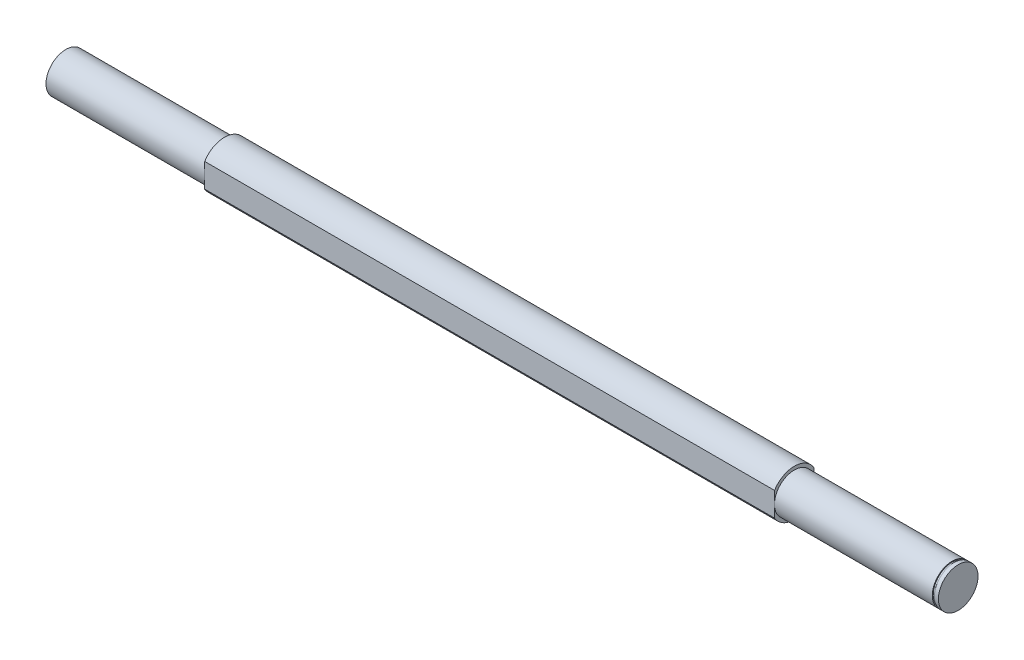
ISO-10303-21;
HEADER;
FILE_DESCRIPTION(('STEP AP214'),'2;1');
FILE_NAME('part.step','',(''),(''),'','','');
FILE_SCHEMA(('AUTOMOTIVE_DESIGN { 1 0 10303 214 1 1 1 1 }'));
ENDSEC;
DATA;
#1=APPLICATION_CONTEXT('core data for automotive mechanical design processes');
#2=APPLICATION_PROTOCOL_DEFINITION('international standard','automotive_design',2000,#1);
#3=PRODUCT_CONTEXT('',#1,'mechanical');
#4=PRODUCT('Part','Part','',(#3));
#5=PRODUCT_RELATED_PRODUCT_CATEGORY('part','',(#4));
#6=PRODUCT_DEFINITION_FORMATION('','',#4);
#7=PRODUCT_DEFINITION_CONTEXT('part definition',#1,'design');
#8=PRODUCT_DEFINITION('design','',#6,#7);
#9=PRODUCT_DEFINITION_SHAPE('','',#8);
#10=(LENGTH_UNIT() NAMED_UNIT(*) SI_UNIT(.MILLI.,.METRE.));
#11=(NAMED_UNIT(*) PLANE_ANGLE_UNIT() SI_UNIT($,.RADIAN.));
#12=(NAMED_UNIT(*) SI_UNIT($,.STERADIAN.) SOLID_ANGLE_UNIT());
#13=UNCERTAINTY_MEASURE_WITH_UNIT(LENGTH_MEASURE(1.E-05),#10,'distance_accuracy_value','');
#14=(GEOMETRIC_REPRESENTATION_CONTEXT(3) GLOBAL_UNCERTAINTY_ASSIGNED_CONTEXT((#13)) GLOBAL_UNIT_ASSIGNED_CONTEXT((#10,
#11,#12)) REPRESENTATION_CONTEXT('',''));
#15=CARTESIAN_POINT('',(0.,0.,0.));
#16=DIRECTION('',(0.,0.,1.));
#17=DIRECTION('',(1.,0.,0.));
#18=AXIS2_PLACEMENT_3D('',#15,#16,#17);
#19=CARTESIAN_POINT('',(-337.5,0.,0.));
#20=DIRECTION('',(-1.,0.,0.));
#21=DIRECTION('',(0.,0.,1.));
#22=AXIS2_PLACEMENT_3D('',#19,#20,#21);
#23=CYLINDRICAL_SURFACE('',#22,15.);
#24=CARTESIAN_POINT('',(332.9,0.,0.));
#25=DIRECTION('',(1.,0.,0.));
#26=DIRECTION('',(0.,1.,0.));
#27=AXIS2_PLACEMENT_3D('',#24,#25,#26);
#28=CIRCLE('',#27,15.);
#29=CARTESIAN_POINT('',(332.9,15.,0.));
#30=VERTEX_POINT('',#29);
#31=EDGE_CURVE('E166',#30,#30,#28,.T.);
#32=ORIENTED_EDGE('',*,*,#31,.F.);
#33=EDGE_LOOP('',(#32));
#34=FACE_BOUND('',#33,.T.);
#35=CARTESIAN_POINT('',(213.5,0.,0.));
#36=DIRECTION('',(-1.,0.,0.));
#37=DIRECTION('',(0.,0.,1.));
#38=AXIS2_PLACEMENT_3D('',#35,#36,#37);
#39=CIRCLE('',#38,15.);
#40=CARTESIAN_POINT('',(213.5,0.104892540191236,14.9996332473502));
#41=VERTEX_POINT('',#40);
#42=CARTESIAN_POINT('',(213.5,0.104892540191236,-14.9996332473502));
#43=VERTEX_POINT('',#42);
#44=EDGE_CURVE('E260',#41,#43,#39,.T.);
#45=ORIENTED_EDGE('',*,*,#44,.F.);
#46=EDGE_CURVE('E259',#43,#41,#39,.T.);
#47=ORIENTED_EDGE('',*,*,#46,.F.);
#48=EDGE_LOOP('',(#45,#47));
#49=FACE_BOUND('',#48,.T.);
#50=CARTESIAN_POINT('',(289.5,-5.00000000000002,-14.142135623731));
#51=CARTESIAN_POINT('',(289.363588172093,-5.00001928272084,-14.1421132795953));
#52=CARTESIAN_POINT('',(289.227185014359,-4.9944183946003,-14.144108585197));
#53=CARTESIAN_POINT('',(288.955436759906,-4.97212026561634,-14.1519707752355));
#54=CARTESIAN_POINT('',(288.820091387547,-4.9554260201333,-14.1578366145645));
#55=CARTESIAN_POINT('',(288.551821342899,-4.9111504844288,-14.1732535212275));
#56=CARTESIAN_POINT('',(288.418890703097,-4.88360148534078,-14.1827936562481));
#57=CARTESIAN_POINT('',(288.155975354343,-4.81787909036064,-14.2052544389482));
#58=CARTESIAN_POINT('',(288.025990752042,-4.7797053104926,-14.2181752088016));
#59=CARTESIAN_POINT('',(287.76994100167,-4.69309505128878,-14.2469974292543));
#60=CARTESIAN_POINT('',(287.643872780107,-4.64466686529957,-14.2628964699579));
#61=CARTESIAN_POINT('',(287.39633145206,-4.53792631398364,-14.2972152683245));
#62=CARTESIAN_POINT('',(287.274860080899,-4.47961026060575,-14.3156359660384));
#63=CARTESIAN_POINT('',(286.918431071588,-4.29042487291367,-14.3739242294785));
#64=CARTESIAN_POINT('',(286.691349816362,-4.14528130436109,-14.4168308914588));
#65=CARTESIAN_POINT('',(286.256362129662,-3.81524041281298,-14.5077282855086));
#66=CARTESIAN_POINT('',(286.049415751017,-3.62912046165332,-14.5558450324036));
#67=CARTESIAN_POINT('',(285.668979759463,-3.22494665570402,-14.6506912904573));
#68=CARTESIAN_POINT('',(285.495496104132,-3.006887126647,-14.6974205533429));
#69=CARTESIAN_POINT('',(285.182599665868,-2.53801699448499,-14.7856944680589));
#70=CARTESIAN_POINT('',(285.04419434374,-2.28650011670831,-14.8270719634014));
#71=CARTESIAN_POINT('',(284.812039475589,-1.76214657981255,-14.8984803449503));
#72=CARTESIAN_POINT('',(284.718276288113,-1.48931646315729,-14.92851469674));
#73=CARTESIAN_POINT('',(284.581321179189,-0.940146645163365,-14.9729535792742));
#74=CARTESIAN_POINT('',(284.536483572903,-0.664259156539224,-14.9878654569488));
#75=CARTESIAN_POINT('',(284.493418571686,-0.108494863035928,-15.0021804126725));
#76=CARTESIAN_POINT('',(284.495180070613,0.171380975391818,-15.0015871861129));
#77=CARTESIAN_POINT('',(284.544221351199,0.715519207983856,-14.9853019394036));
#78=CARTESIAN_POINT('',(284.589712996874,0.979963426374058,-14.9702030725849));
#79=CARTESIAN_POINT('',(284.721966186306,1.49722040864174,-14.9273480020182));
#80=CARTESIAN_POINT('',(284.80873001845,1.75003252671059,-14.8995910964333));
#81=CARTESIAN_POINT('',(285.02210613128,2.240762782204,-14.8337834991293));
#82=CARTESIAN_POINT('',(285.149227537907,2.47844127676376,-14.7956022127902));
#83=CARTESIAN_POINT('',(285.439302445391,2.9296241973344,-14.7129190630403));
#84=CARTESIAN_POINT('',(285.602265693331,3.14312202351084,-14.6684154814678));
#85=CARTESIAN_POINT('',(285.96834474013,3.55048180391259,-14.5753148518701));
#86=CARTESIAN_POINT('',(286.172987637848,3.74294939170371,-14.5266237190253));
#87=CARTESIAN_POINT('',(286.612247541709,4.09137879648191,-14.4323697370697));
#88=CARTESIAN_POINT('',(286.846874193755,4.24732881968224,-14.3868079019513));
#89=CARTESIAN_POINT('',(287.218391187969,4.45137197181612,-14.3244699574743));
#90=CARTESIAN_POINT('',(287.346569255959,4.51477947987293,-14.3045606178995));
#91=CARTESIAN_POINT('',(287.608206226196,4.63050119526384,-14.2675208843929));
#92=CARTESIAN_POINT('',(287.741662902595,4.68282002045477,-14.2503893343581));
#93=CARTESIAN_POINT('',(288.012771358208,4.77584283639461,-14.2194841629367));
#94=CARTESIAN_POINT('',(288.15041839138,4.81655946314395,-14.205706890793));
#95=CARTESIAN_POINT('',(288.42896019306,4.88604801985985,-14.1819560641116));
#96=CARTESIAN_POINT('',(288.569853447453,4.91482540411387,-14.1719807728584));
#97=CARTESIAN_POINT('',(288.842053058189,4.95827453687227,-14.156836654448));
#98=CARTESIAN_POINT('',(288.973186899474,4.97391718926362,-14.1513381564974));
#99=CARTESIAN_POINT('',(289.236210415875,4.99478118687351,-14.143980412972));
#100=CARTESIAN_POINT('',(289.368098894585,5.00001597952914,-14.1421164714419));
#101=CARTESIAN_POINT('',(289.5,4.99999999999998,-14.142135623731));
#102=B_SPLINE_CURVE_WITH_KNOTS('',3,(#50,#51,#52,#53,#54,#55,#56,#57,#58,#59,#60,#61,#62,#63,
#64,#65,#66,#67,#68,#69,#70,#71,#72,#73,#74,#75,#76,#77,#78,#79,#80,#81,#82,#83,#84,#85,#86,#87,
#88,#89,#90,#91,#92,#93,#94,#95,#96,#97,#98,#99,#100,#101),.UNSPECIFIED.,.F.,.F.,(4,2,2,2,2,2,2,
2,2,2,2,2,2,2,2,2,2,2,2,2,2,2,2,2,2,4),(0.,0.409092423677147,0.818074430847326,1.22584885885823,
1.63363802561081,2.04109864022583,2.44871156823775,3.26359482908315,4.1072485115405,
4.95105225659396,5.81687991006165,6.68244281946297,7.51789679977675,8.35315166493872,
9.15564418669337,9.95818120881901,10.771274204705,11.584588592845,12.4361259663091,
13.2879379758687,13.7206337000479,14.1531488734623,14.5851911765746,15.0170358888757,
15.4131122811712,15.8086765909865),.UNSPECIFIED.);
#103=CARTESIAN_POINT('',(289.5,-5.00000000000002,-14.1421356237309));
#104=VERTEX_POINT('',#103);
#105=CARTESIAN_POINT('',(289.5,4.99999999999998,-14.142135623731));
#106=VERTEX_POINT('',#105);
#107=EDGE_CURVE('E319',#104,#106,#102,.T.);
#108=ORIENTED_EDGE('',*,*,#107,.F.);
#109=DIRECTION('',(-1.,0.,0.));
#110=VECTOR('',#109,1.);
#111=CARTESIAN_POINT('',(-337.5,-5.00000000000009,-14.1421356237309));
#112=LINE('',#111,#110);
#113=CARTESIAN_POINT('',(324.5,-5.00000000000002,-14.142135623731));
#114=VERTEX_POINT('',#113);
#115=EDGE_CURVE('E11',#114,#104,#112,.T.);
#116=ORIENTED_EDGE('',*,*,#115,.F.);
#117=CARTESIAN_POINT('',(324.5,4.99999999999998,-14.142135623731));
#118=CARTESIAN_POINT('',(324.636411827907,5.00001928272079,-14.1421132795954));
#119=CARTESIAN_POINT('',(324.772814985641,4.99441839460026,-14.144108585197));
#120=CARTESIAN_POINT('',(325.044563240094,4.97212026561629,-14.1519707752355));
#121=CARTESIAN_POINT('',(325.179908612454,4.95542602013326,-14.1578366145645));
#122=CARTESIAN_POINT('',(325.448178657101,4.91115048442877,-14.1732535212275));
#123=CARTESIAN_POINT('',(325.581109296903,4.88360148534074,-14.1827936562481));
#124=CARTESIAN_POINT('',(325.844024645658,4.8178790903606,-14.2052544389482));
#125=CARTESIAN_POINT('',(325.974009247958,4.77970531049256,-14.2181752088016));
#126=CARTESIAN_POINT('',(326.23005899833,4.69309505128872,-14.2469974292543));
#127=CARTESIAN_POINT('',(326.356127219894,4.64466686529951,-14.2628964699579));
#128=CARTESIAN_POINT('',(326.60366854794,4.53792631398359,-14.2972152683245));
#129=CARTESIAN_POINT('',(326.725139919102,4.4796102606057,-14.3156359660384));
#130=CARTESIAN_POINT('',(327.081568928413,4.29042487291362,-14.3739242294785));
#131=CARTESIAN_POINT('',(327.308650183639,4.14528130436104,-14.4168308914588));
#132=CARTESIAN_POINT('',(327.743637870338,3.81524041281293,-14.5077282855086));
#133=CARTESIAN_POINT('',(327.950584248983,3.62912046165327,-14.5558450324036));
#134=CARTESIAN_POINT('',(328.331020240538,3.22494665570397,-14.6506912904573));
#135=CARTESIAN_POINT('',(328.504503895869,3.00688712664695,-14.6974205533429));
#136=CARTESIAN_POINT('',(328.817400334132,2.53801699448494,-14.7856944680589));
#137=CARTESIAN_POINT('',(328.955805656261,2.28650011670826,-14.8270719634014));
#138=CARTESIAN_POINT('',(329.187960524412,1.76214657981251,-14.8984803449503));
#139=CARTESIAN_POINT('',(329.281723711888,1.48931646315725,-14.92851469674));
#140=CARTESIAN_POINT('',(329.418678820812,0.940146645163319,-14.9729535792742));
#141=CARTESIAN_POINT('',(329.463516427098,0.664259156539177,-14.9878654569488));
#142=CARTESIAN_POINT('',(329.506581428314,0.108494863035881,-15.0021804126725));
#143=CARTESIAN_POINT('',(329.504819929388,-0.171380975391865,-15.0015871861129));
#144=CARTESIAN_POINT('',(329.455778648802,-0.715519207983898,-14.9853019394036));
#145=CARTESIAN_POINT('',(329.410287003127,-0.979963426374096,-14.9702030725849));
#146=CARTESIAN_POINT('',(329.278033813695,-1.49722040864178,-14.9273480020182));
#147=CARTESIAN_POINT('',(329.19126998155,-1.75003252671063,-14.8995910964333));
#148=CARTESIAN_POINT('',(328.977893868721,-2.24076278220405,-14.8337834991293));
#149=CARTESIAN_POINT('',(328.850772462094,-2.47844127676381,-14.7956022127902));
#150=CARTESIAN_POINT('',(328.56069755461,-2.92962419733445,-14.7129190630403));
#151=CARTESIAN_POINT('',(328.39773430667,-3.14312202351089,-14.6684154814678));
#152=CARTESIAN_POINT('',(328.03165525987,-3.55048180391264,-14.5753148518701));
#153=CARTESIAN_POINT('',(327.827012362153,-3.74294939170376,-14.5266237190253));
#154=CARTESIAN_POINT('',(327.387752458292,-4.09137879648195,-14.4323697370697));
#155=CARTESIAN_POINT('',(327.153125806246,-4.24732881968229,-14.3868079019513));
#156=CARTESIAN_POINT('',(326.781608812031,-4.45137197181615,-14.3244699574743));
#157=CARTESIAN_POINT('',(326.653430744042,-4.51477947987296,-14.3045606178995));
#158=CARTESIAN_POINT('',(326.391793773804,-4.63050119526387,-14.2675208843929));
#159=CARTESIAN_POINT('',(326.258337097406,-4.68282002045482,-14.2503893343581));
#160=CARTESIAN_POINT('',(325.987228641792,-4.77584283639466,-14.2194841629367));
#161=CARTESIAN_POINT('',(325.84958160862,-4.816559463144,-14.205706890793));
#162=CARTESIAN_POINT('',(325.571039806941,-4.88604801985991,-14.1819560641116));
#163=CARTESIAN_POINT('',(325.430146552548,-4.91482540411392,-14.1719807728584));
#164=CARTESIAN_POINT('',(325.157946941812,-4.95827453687232,-14.156836654448));
#165=CARTESIAN_POINT('',(325.026813100527,-4.97391718926367,-14.1513381564974));
#166=CARTESIAN_POINT('',(324.763789584126,-4.99478118687355,-14.143980412972));
#167=CARTESIAN_POINT('',(324.631901105415,-5.00001597952918,-14.1421164714419));
#168=CARTESIAN_POINT('',(324.5,-5.00000000000002,-14.142135623731));
#169=B_SPLINE_CURVE_WITH_KNOTS('',3,(#117,#118,#119,#120,#121,#122,#123,#124,#125,#126,#127,
#128,#129,#130,#131,#132,#133,#134,#135,#136,#137,#138,#139,#140,#141,#142,#143,#144,#145,#146,
#147,#148,#149,#150,#151,#152,#153,#154,#155,#156,#157,#158,#159,#160,#161,#162,#163,#164,#165,
#166,#167,#168),.UNSPECIFIED.,.F.,.F.,(4,2,2,2,2,2,2,2,2,2,2,2,2,2,2,2,2,2,2,2,2,2,2,2,2,4),(0.,
0.409092423677147,0.81807443084727,1.22584885885817,1.63363802561081,2.04109864022588,
2.44871156823775,3.26359482908315,4.1072485115405,4.95105225659396,5.81687991006165,
6.68244281946297,7.51789679977675,8.35315166493872,9.15564418669335,9.95818120881901,
10.771274204705,11.584588592845,12.4361259663091,13.2879379758687,13.7206337000479,
14.1531488734623,14.5851911765747,15.0170358888757,15.4131122811713,15.8086765909865),.UNSPECIFIED.);
#170=CARTESIAN_POINT('',(324.5,4.99999999999998,-14.142135623731));
#171=VERTEX_POINT('',#170);
#172=EDGE_CURVE('E49',#171,#114,#169,.T.);
#173=ORIENTED_EDGE('',*,*,#172,.F.);
#174=DIRECTION('',(-1.,0.,0.));
#175=VECTOR('',#174,1.);
#176=CARTESIAN_POINT('',(-337.5,4.99999999999991,-14.142135623731));
#177=LINE('',#176,#175);
#178=EDGE_CURVE('E164',#106,#171,#177,.F.);
#179=ORIENTED_EDGE('',*,*,#178,.F.);
#180=EDGE_LOOP('',(#108,#116,#173,#179));
#181=FACE_BOUND('',#180,.T.);
#182=ADVANCED_FACE('F39',(#34,#49,#181),#23,.T.);
#183=CARTESIAN_POINT('',(-337.5,0.,0.));
#184=DIRECTION('',(-1.,0.,0.));
#185=DIRECTION('',(0.,0.,1.));
#186=AXIS2_PLACEMENT_3D('',#183,#184,#185);
#187=CYLINDRICAL_SURFACE('',#186,15.);
#188=CARTESIAN_POINT('',(-337.5,0.,0.));
#189=DIRECTION('',(-1.,0.,0.));
#190=DIRECTION('',(0.,0.,1.));
#191=AXIS2_PLACEMENT_3D('',#188,#189,#190);
#192=CIRCLE('',#191,15.);
#193=CARTESIAN_POINT('',(-337.5,0.,15.));
#194=VERTEX_POINT('',#193);
#195=EDGE_CURVE('E268',#194,#194,#192,.T.);
#196=ORIENTED_EDGE('',*,*,#195,.F.);
#197=EDGE_LOOP('',(#196));
#198=FACE_BOUND('',#197,.T.);
#199=CARTESIAN_POINT('',(-217.5,0.,0.));
#200=DIRECTION('',(-1.,0.,0.));
#201=DIRECTION('',(0.,0.,1.));
#202=AXIS2_PLACEMENT_3D('',#199,#200,#201);
#203=CIRCLE('',#202,15.);
#204=CARTESIAN_POINT('',(-217.5,0.104892540191234,14.9996332473502));
#205=VERTEX_POINT('',#204);
#206=CARTESIAN_POINT('',(-217.5,0.104892540191234,-14.9996332473502));
#207=VERTEX_POINT('',#206);
#208=EDGE_CURVE('E245',#205,#207,#203,.T.);
#209=ORIENTED_EDGE('',*,*,#208,.T.);
#210=EDGE_CURVE('E232',#207,#205,#203,.T.);
#211=ORIENTED_EDGE('',*,*,#210,.T.);
#212=EDGE_LOOP('',(#209,#211));
#213=FACE_BOUND('',#212,.T.);
#214=CARTESIAN_POINT('',(-311.5,4.,-14.456832294801));
#215=CARTESIAN_POINT('',(-311.389641756596,4.00001309389174,-14.4568189842467));
#216=CARTESIAN_POINT('',(-311.279291478007,3.99543311151603,-14.4580956467717));
#217=CARTESIAN_POINT('',(-311.059421346034,3.97718874589725,-14.4631301353517));
#218=CARTESIAN_POINT('',(-310.94990134224,3.96352604983924,-14.4668875005959));
#219=CARTESIAN_POINT('',(-310.732698346486,3.92725695741262,-14.4767740441058));
#220=CARTESIAN_POINT('',(-310.625011912152,3.90466984692446,-14.482898107258));
#221=CARTESIAN_POINT('',(-310.412025139644,3.85076543838184,-14.4973231400467));
#222=CARTESIAN_POINT('',(-310.306724843415,3.81944798699436,-14.5056241479174));
#223=CARTESIAN_POINT('',(-309.995536581225,3.71275643853686,-14.5334412456827));
#224=CARTESIAN_POINT('',(-309.794125066453,3.62460332607934,-14.5558829598252));
#225=CARTESIAN_POINT('',(-309.408979240374,3.41695780475819,-14.6060171290377));
#226=CARTESIAN_POINT('',(-309.225250796028,3.29745504324306,-14.6337113178035));
#227=CARTESIAN_POINT('',(-308.876029423072,3.02730320878009,-14.6920016406366));
#228=CARTESIAN_POINT('',(-308.711038159034,2.87601544465618,-14.7226489452442));
#229=CARTESIAN_POINT('',(-308.408442433038,2.54795832924029,-14.7829523618628));
#230=CARTESIAN_POINT('',(-308.270842417132,2.3711848492125,-14.8126083123117));
#231=CARTESIAN_POINT('',(-308.024827869815,1.99367199592158,-14.8681604116921));
#232=CARTESIAN_POINT('',(-307.916916034422,1.79259414843398,-14.8939887414057));
#233=CARTESIAN_POINT('',(-307.736627111039,1.37435575552791,-14.9383834129136));
#234=CARTESIAN_POINT('',(-307.664242355223,1.15719869214847,-14.9569513215518));
#235=CARTESIAN_POINT('',(-307.558690174831,0.718234307369668,-14.9843709217852));
#236=CARTESIAN_POINT('',(-307.524662787106,0.496647293428101,-14.9934353394137));
#237=CARTESIAN_POINT('',(-307.494085686777,0.0507319917605722,-15.0015705103632));
#238=CARTESIAN_POINT('',(-307.497530515807,-0.173595891963459,-15.0006427191926));
#239=CARTESIAN_POINT('',(-307.541195686368,-0.61262950264217,-14.9890534931376));
#240=CARTESIAN_POINT('',(-307.580486127656,-0.827435206418321,-14.9786381919443));
#241=CARTESIAN_POINT('',(-307.693225150863,-1.24728467665105,-14.9495347795913));
#242=CARTESIAN_POINT('',(-307.766675352151,-1.45232797980576,-14.9308462762364));
#243=CARTESIAN_POINT('',(-307.946359966253,-1.84920963545356,-14.8869312076945));
#244=CARTESIAN_POINT('',(-308.05291337223,-2.04089626466617,-14.8616414267933));
#245=CARTESIAN_POINT('',(-308.295542768965,-2.40398441957149,-14.8072486052897));
#246=CARTESIAN_POINT('',(-308.431623922183,-2.57538239000351,-14.7781448982353));
#247=CARTESIAN_POINT('',(-308.734327971101,-2.89854935036781,-14.7182294237973));
#248=CARTESIAN_POINT('',(-308.901758007894,-3.0495572240081,-14.6873926412644));
#249=CARTESIAN_POINT('',(-309.260042840709,-3.32161448391784,-14.6282716207252));
#250=CARTESIAN_POINT('',(-309.450904096481,-3.4426555807802,-14.5999880903709));
#251=CARTESIAN_POINT('',(-309.751353283365,-3.59932937334134,-14.5618587427771));
#252=CARTESIAN_POINT('',(-309.854288915041,-3.64754371945349,-14.5498268172621));
#253=CARTESIAN_POINT('',(-310.064046321272,-3.73509417643328,-14.5275984074125));
#254=CARTESIAN_POINT('',(-310.170866512463,-3.77443385857866,-14.5174011851057));
#255=CARTESIAN_POINT('',(-310.38751941922,-3.84386783810503,-14.4991713081511));
#256=CARTESIAN_POINT('',(-310.497348878193,-3.87397173088606,-14.4911364080612));
#257=CARTESIAN_POINT('',(-310.719275221125,-3.92471856960776,-14.4774747012191));
#258=CARTESIAN_POINT('',(-310.83137102282,-3.94536592495321,-14.4718467722231));
#259=CARTESIAN_POINT('',(-311.036251024718,-3.97411378733402,-14.4639761334309));
#260=CARTESIAN_POINT('',(-311.128796446167,-3.98382319960776,-14.4613012625133));
#261=CARTESIAN_POINT('',(-311.31422535331,-3.99676420153355,-14.4577275048596));
#262=CARTESIAN_POINT('',(-311.407108070432,-4.00000603663184,-14.4568258092259));
#263=CARTESIAN_POINT('',(-311.5,-4.,-14.456832294801));
#264=B_SPLINE_CURVE_WITH_KNOTS('',3,(#214,#215,#216,#217,#218,#219,#220,#221,#222,#223,#224,
#225,#226,#227,#228,#229,#230,#231,#232,#233,#234,#235,#236,#237,#238,#239,#240,#241,#242,#243,
#244,#245,#246,#247,#248,#249,#250,#251,#252,#253,#254,#255,#256,#257,#258,#259,#260,#261,#262,
#263),.UNSPECIFIED.,.F.,.F.,(4,2,2,2,2,2,2,2,2,2,2,2,2,2,2,2,2,2,2,2,2,2,2,2,4),(0.,
0.330958670878051,0.66185588076851,0.992041890688623,1.32223370010826,1.98190700187182,
2.64179842357632,3.31649637536146,3.99130375261115,4.67691814590523,5.36238449759351,
6.03215661862344,6.7018311790669,7.35461236515044,8.00742449996359,8.66673340793704,
9.32615767867958,10.0057598785669,10.6855498604333,11.0281077435251,11.3705275300853,
11.7125903499582,12.0544935096115,12.3335333037377,12.6121307120355),.UNSPECIFIED.);
#265=CARTESIAN_POINT('',(-311.5,4.,-14.456832294801));
#266=VERTEX_POINT('',#265);
#267=CARTESIAN_POINT('',(-311.5,-4.,-14.456832294801));
#268=VERTEX_POINT('',#267);
#269=EDGE_CURVE('E280',#266,#268,#264,.T.);
#270=ORIENTED_EDGE('',*,*,#269,.F.);
#271=DIRECTION('',(-1.,0.,0.));
#272=VECTOR('',#271,1.);
#273=CARTESIAN_POINT('',(-337.5,4.,-14.456832294801));
#274=LINE('',#273,#272);
#275=CARTESIAN_POINT('',(-331.5,4.,-14.456832294801));
#276=VERTEX_POINT('',#275);
#277=EDGE_CURVE('E316',#276,#266,#274,.F.);
#278=ORIENTED_EDGE('',*,*,#277,.F.);
#279=CARTESIAN_POINT('',(-331.5,-4.,-14.456832294801));
#280=CARTESIAN_POINT('',(-331.610358243404,-4.00001309389174,-14.4568189842467));
#281=CARTESIAN_POINT('',(-331.720708521993,-3.99543311151603,-14.4580956467717));
#282=CARTESIAN_POINT('',(-331.940578653966,-3.97718874589725,-14.4631301353517));
#283=CARTESIAN_POINT('',(-332.05009865776,-3.96352604983924,-14.4668875005959));
#284=CARTESIAN_POINT('',(-332.267301653514,-3.92725695741262,-14.4767740441058));
#285=CARTESIAN_POINT('',(-332.374988087848,-3.90466984692446,-14.482898107258));
#286=CARTESIAN_POINT('',(-332.587974860356,-3.85076543838184,-14.4973231400467));
#287=CARTESIAN_POINT('',(-332.693275156585,-3.81944798699436,-14.5056241479174));
#288=CARTESIAN_POINT('',(-333.004463418775,-3.71275643853686,-14.5334412456827));
#289=CARTESIAN_POINT('',(-333.205874933547,-3.62460332607936,-14.5558829598252));
#290=CARTESIAN_POINT('',(-333.591020759626,-3.41695780475822,-14.6060171290377));
#291=CARTESIAN_POINT('',(-333.774749203972,-3.29745504324307,-14.6337113178035));
#292=CARTESIAN_POINT('',(-334.123970576928,-3.02730320878009,-14.6920016406366));
#293=CARTESIAN_POINT('',(-334.288961840966,-2.87601544465619,-14.7226489452442));
#294=CARTESIAN_POINT('',(-334.591557566962,-2.54795832924029,-14.7829523618628));
#295=CARTESIAN_POINT('',(-334.729157582868,-2.3711848492125,-14.8126083123117));
#296=CARTESIAN_POINT('',(-334.975172130185,-1.99367199592158,-14.8681604116921));
#297=CARTESIAN_POINT('',(-335.083083965578,-1.79259414843398,-14.8939887414057));
#298=CARTESIAN_POINT('',(-335.263372888961,-1.37435575552791,-14.9383834129136));
#299=CARTESIAN_POINT('',(-335.335757644777,-1.15719869214847,-14.9569513215518));
#300=CARTESIAN_POINT('',(-335.441309825169,-0.718234307369666,-14.9843709217852));
#301=CARTESIAN_POINT('',(-335.475337212894,-0.4966472934281,-14.9934353394137));
#302=CARTESIAN_POINT('',(-335.505914313223,-0.0507319917605707,-15.0015705103632));
#303=CARTESIAN_POINT('',(-335.502469484193,0.173595891963461,-15.0006427191926));
#304=CARTESIAN_POINT('',(-335.458804313632,0.612629502642172,-14.9890534931376));
#305=CARTESIAN_POINT('',(-335.419513872344,0.827435206418322,-14.9786381919443));
#306=CARTESIAN_POINT('',(-335.306774849137,1.24728467665105,-14.9495347795912));
#307=CARTESIAN_POINT('',(-335.233324647849,1.45232797980576,-14.9308462762364));
#308=CARTESIAN_POINT('',(-335.053640033747,1.84920963545356,-14.8869312076945));
#309=CARTESIAN_POINT('',(-334.94708662777,2.04089626466618,-14.8616414267933));
#310=CARTESIAN_POINT('',(-334.704457231035,2.40398441957149,-14.8072486052897));
#311=CARTESIAN_POINT('',(-334.568376077817,2.57538239000351,-14.7781448982353));
#312=CARTESIAN_POINT('',(-334.265672028899,2.89854935036781,-14.7182294237973));
#313=CARTESIAN_POINT('',(-334.098241992106,3.0495572240081,-14.6873926412643));
#314=CARTESIAN_POINT('',(-333.739957159291,3.32161448391784,-14.6282716207252));
#315=CARTESIAN_POINT('',(-333.549095903519,3.4426555807802,-14.5999880903709));
#316=CARTESIAN_POINT('',(-333.248646716635,3.59932937334134,-14.5618587427771));
#317=CARTESIAN_POINT('',(-333.145711084959,3.64754371945349,-14.5498268172621));
#318=CARTESIAN_POINT('',(-332.935953678729,3.73509417643329,-14.5275984074125));
#319=CARTESIAN_POINT('',(-332.829133487537,3.77443385857866,-14.5174011851057));
#320=CARTESIAN_POINT('',(-332.61248058078,3.84386783810503,-14.4991713081511));
#321=CARTESIAN_POINT('',(-332.502651121807,3.87397173088606,-14.4911364080612));
#322=CARTESIAN_POINT('',(-332.280724778875,3.92471856960776,-14.4774747012191));
#323=CARTESIAN_POINT('',(-332.16862897718,3.94536592495321,-14.4718467722231));
#324=CARTESIAN_POINT('',(-331.963748975282,3.97411378733402,-14.4639761334309));
#325=CARTESIAN_POINT('',(-331.871203553833,3.98382319960776,-14.4613012625133));
#326=CARTESIAN_POINT('',(-331.68577464669,3.99676420153355,-14.4577275048596));
#327=CARTESIAN_POINT('',(-331.592891929568,4.00000603663183,-14.4568258092259));
#328=CARTESIAN_POINT('',(-331.5,4.,-14.456832294801));
#329=B_SPLINE_CURVE_WITH_KNOTS('',3,(#279,#280,#281,#282,#283,#284,#285,#286,#287,#288,#289,
#290,#291,#292,#293,#294,#295,#296,#297,#298,#299,#300,#301,#302,#303,#304,#305,#306,#307,#308,
#309,#310,#311,#312,#313,#314,#315,#316,#317,#318,#319,#320,#321,#322,#323,#324,#325,#326,#327,
#328),.UNSPECIFIED.,.F.,.F.,(4,2,2,2,2,2,2,2,2,2,2,2,2,2,2,2,2,2,2,2,2,2,2,2,4),(0.,
0.330958670878051,0.66185588076851,0.992041890688623,1.32223370010826,1.98190700187175,
2.64179842357632,3.31649637536146,3.99130375261115,4.67691814590523,5.36238449759351,
6.03215661862344,6.7018311790669,7.35461236515044,8.00742449996359,8.66673340793704,
9.32615767867958,10.0057598785669,10.6855498604333,11.0281077435251,11.3705275300853,
11.7125903499582,12.0544935096115,12.3335333037377,12.6121307120355),.UNSPECIFIED.);
#330=CARTESIAN_POINT('',(-331.5,-4.,-14.456832294801));
#331=VERTEX_POINT('',#330);
#332=EDGE_CURVE('E309',#331,#276,#329,.T.);
#333=ORIENTED_EDGE('',*,*,#332,.F.);
#334=DIRECTION('',(-1.,0.,0.));
#335=VECTOR('',#334,1.);
#336=CARTESIAN_POINT('',(-337.5,-4.,-14.456832294801));
#337=LINE('',#336,#335);
#338=EDGE_CURVE('E288',#268,#331,#337,.T.);
#339=ORIENTED_EDGE('',*,*,#338,.F.);
#340=EDGE_LOOP('',(#270,#278,#333,#339));
#341=FACE_BOUND('',#340,.T.);
#342=ADVANCED_FACE('F41',(#198,#213,#341),#187,.T.);
#343=CARTESIAN_POINT('',(213.5,17.5,0.));
#344=DIRECTION('',(-1.,0.,0.));
#345=DIRECTION('',(0.,0.,1.));
#346=AXIS2_PLACEMENT_3D('',#343,#344,#345);
#347=PLANE('',#346);
#348=CARTESIAN_POINT('',(213.5,0.,0.));
#349=DIRECTION('',(-1.,0.,0.));
#350=DIRECTION('',(0.,0.,1.));
#351=AXIS2_PLACEMENT_3D('',#348,#349,#350);
#352=CIRCLE('',#351,17.5);
#353=CARTESIAN_POINT('',(213.5,-8.90876525755466,-15.0626658193624));
#354=VERTEX_POINT('',#353);
#355=CARTESIAN_POINT('',(213.5,-8.90876525755465,15.0626658193624));
#356=VERTEX_POINT('',#355);
#357=EDGE_CURVE('E254',#354,#356,#352,.T.);
#358=ORIENTED_EDGE('',*,*,#357,.F.);
#359=DIRECTION('',(0.,-0.999975549823344,-0.0069928360127505));
#360=VECTOR('',#359,1.);
#361=CARTESIAN_POINT('',(213.5,9.11855033793717,-14.9366006753379));
#362=LINE('',#361,#360);
#363=EDGE_CURVE('E226',#43,#354,#362,.T.);
#364=ORIENTED_EDGE('',*,*,#363,.F.);
#365=ORIENTED_EDGE('',*,*,#46,.T.);
#366=DIRECTION('',(0.,0.999975549823344,-0.0069928360127505));
#367=VECTOR('',#366,1.);
#368=CARTESIAN_POINT('',(213.5,9.11855033793717,14.9366006753379));
#369=LINE('',#368,#367);
#370=EDGE_CURVE('E221',#356,#41,#369,.T.);
#371=ORIENTED_EDGE('',*,*,#370,.F.);
#372=EDGE_LOOP('',(#358,#364,#365,#371));
#373=FACE_BOUND('',#372,.T.);
#374=ADVANCED_FACE('F386',(#373),#347,.F.);
#375=CARTESIAN_POINT('',(-337.5,0.,0.));
#376=DIRECTION('',(-1.,0.,0.));
#377=DIRECTION('',(0.,0.,1.));
#378=AXIS2_PLACEMENT_3D('',#375,#376,#377);
#379=CYLINDRICAL_SURFACE('',#378,17.5);
#380=CARTESIAN_POINT('',(213.5,9.11855033793717,14.9366006753379));
#381=VERTEX_POINT('',#380);
#382=CARTESIAN_POINT('',(213.5,9.11855033793717,-14.9366006753379));
#383=VERTEX_POINT('',#382);
#384=EDGE_CURVE('E255',#381,#383,#352,.T.);
#385=ORIENTED_EDGE('',*,*,#384,.T.);
#386=DIRECTION('',(-1.,0.,0.));
#387=VECTOR('',#386,1.);
#388=CARTESIAN_POINT('',(231.708655185849,9.11855033793717,-14.9366006753379));
#389=LINE('',#388,#387);
#390=CARTESIAN_POINT('',(-217.5,9.11855033793717,-14.9366006753379));
#391=VERTEX_POINT('',#390);
#392=EDGE_CURVE('E222',#383,#391,#389,.T.);
#393=ORIENTED_EDGE('',*,*,#392,.T.);
#394=CARTESIAN_POINT('',(-217.5,0.,0.));
#395=DIRECTION('',(-1.,0.,0.));
#396=DIRECTION('',(0.,0.,1.));
#397=AXIS2_PLACEMENT_3D('',#394,#395,#396);
#398=CIRCLE('',#397,17.5);
#399=CARTESIAN_POINT('',(-217.5,9.11855033793717,14.9366006753379));
#400=VERTEX_POINT('',#399);
#401=EDGE_CURVE('E250',#400,#391,#398,.T.);
#402=ORIENTED_EDGE('',*,*,#401,.F.);
#403=DIRECTION('',(-1.,0.,0.));
#404=VECTOR('',#403,1.);
#405=CARTESIAN_POINT('',(231.708655185849,9.11855033793717,14.9366006753379));
#406=LINE('',#405,#404);
#407=EDGE_CURVE('E235',#381,#400,#406,.T.);
#408=ORIENTED_EDGE('',*,*,#407,.F.);
#409=EDGE_LOOP('',(#385,#393,#402,#408));
#410=FACE_BOUND('',#409,.T.);
#411=ADVANCED_FACE('F376',(#410),#379,.T.);
#412=CARTESIAN_POINT('',(-217.5,15.,0.));
#413=DIRECTION('',(1.,0.,0.));
#414=DIRECTION('',(0.,0.,-1.));
#415=AXIS2_PLACEMENT_3D('',#412,#413,#414);
#416=PLANE('',#415);
#417=ORIENTED_EDGE('',*,*,#401,.T.);
#418=DIRECTION('',(0.,-0.999975549823344,-0.0069928360127505));
#419=VECTOR('',#418,1.);
#420=CARTESIAN_POINT('',(-217.5,15.1041590438587,-14.8947432718));
#421=LINE('',#420,#419);
#422=EDGE_CURVE('E276',#391,#207,#421,.T.);
#423=ORIENTED_EDGE('',*,*,#422,.T.);
#424=ORIENTED_EDGE('',*,*,#208,.F.);
#425=DIRECTION('',(0.,-0.999975549823344,0.0069928360127505));
#426=VECTOR('',#425,1.);
#427=CARTESIAN_POINT('',(-217.5,9.11855033793717,14.9366006753379));
#428=LINE('',#427,#426);
#429=EDGE_CURVE('E216',#400,#205,#428,.T.);
#430=ORIENTED_EDGE('',*,*,#429,.F.);
#431=EDGE_LOOP('',(#417,#423,#424,#430));
#432=FACE_BOUND('',#431,.T.);
#433=ADVANCED_FACE('F545',(#432),#416,.F.);
#434=CARTESIAN_POINT('',(-337.5,0.,0.));
#435=DIRECTION('',(1.,0.,0.));
#436=DIRECTION('',(0.,0.,-1.));
#437=AXIS2_PLACEMENT_3D('',#434,#435,#436);
#438=PLANE('',#437);
#439=ORIENTED_EDGE('',*,*,#195,.T.);
#440=EDGE_LOOP('',(#439));
#441=FACE_BOUND('',#440,.T.);
#442=ADVANCED_FACE('F562',(#441),#438,.F.);
#443=ORIENTED_EDGE('',*,*,#44,.T.);
#444=EDGE_CURVE('E229',#383,#43,#362,.T.);
#445=ORIENTED_EDGE('',*,*,#444,.F.);
#446=ORIENTED_EDGE('',*,*,#384,.F.);
#447=EDGE_CURVE('E240',#41,#381,#369,.T.);
#448=ORIENTED_EDGE('',*,*,#447,.F.);
#449=EDGE_LOOP('',(#443,#445,#446,#448));
#450=FACE_BOUND('',#449,.T.);
#451=ADVANCED_FACE('F378',(#450),#347,.F.);
#452=CARTESIAN_POINT('',(-217.5,-8.9087652575547,-15.0626658193624));
#453=VERTEX_POINT('',#452);
#454=CARTESIAN_POINT('',(-217.5,-8.90876525755465,15.0626658193624));
#455=VERTEX_POINT('',#454);
#456=EDGE_CURVE('E249',#453,#455,#398,.T.);
#457=ORIENTED_EDGE('',*,*,#456,.F.);
#458=DIRECTION('',(-1.,0.,0.));
#459=VECTOR('',#458,1.);
#460=CARTESIAN_POINT('',(231.708655185849,-8.90876525755465,-15.0626658193624));
#461=LINE('',#460,#459);
#462=EDGE_CURVE('E220',#354,#453,#461,.T.);
#463=ORIENTED_EDGE('',*,*,#462,.F.);
#464=ORIENTED_EDGE('',*,*,#357,.T.);
#465=DIRECTION('',(-1.,0.,0.));
#466=VECTOR('',#465,1.);
#467=CARTESIAN_POINT('',(231.708655185849,-8.90876525755465,15.0626658193624));
#468=LINE('',#467,#466);
#469=EDGE_CURVE('E236',#356,#455,#468,.T.);
#470=ORIENTED_EDGE('',*,*,#469,.T.);
#471=EDGE_LOOP('',(#457,#463,#464,#470));
#472=FACE_BOUND('',#471,.T.);
#473=ADVANCED_FACE('F542',(#472),#379,.T.);
#474=ORIENTED_EDGE('',*,*,#210,.F.);
#475=DIRECTION('',(0.,0.999975549823344,0.0069928360127505));
#476=VECTOR('',#475,1.);
#477=CARTESIAN_POINT('',(-217.5,9.11855033793717,-14.9366006753379));
#478=LINE('',#477,#476);
#479=EDGE_CURVE('E217',#453,#207,#478,.T.);
#480=ORIENTED_EDGE('',*,*,#479,.F.);
#481=ORIENTED_EDGE('',*,*,#456,.T.);
#482=DIRECTION('',(0.,0.999975549823344,-0.0069928360127505));
#483=VECTOR('',#482,1.);
#484=CARTESIAN_POINT('',(-217.5,15.1041590438587,14.8947432718));
#485=LINE('',#484,#483);
#486=EDGE_CURVE('E272',#455,#205,#485,.T.);
#487=ORIENTED_EDGE('',*,*,#486,.T.);
#488=EDGE_LOOP('',(#474,#480,#481,#487));
#489=FACE_BOUND('',#488,.T.);
#490=ADVANCED_FACE('F533',(#489),#416,.F.);
#491=CARTESIAN_POINT('',(231.708655185849,9.11855033793717,14.9366006753379));
#492=DIRECTION('',(0.,-0.0069928360127505,-0.999975549823344));
#493=DIRECTION('',(0.,0.999975549823344,-0.0069928360127505));
#494=AXIS2_PLACEMENT_3D('',#491,#492,#493);
#495=PLANE('',#494);
#496=ORIENTED_EDGE('',*,*,#370,.T.);
#497=ORIENTED_EDGE('',*,*,#447,.T.);
#498=ORIENTED_EDGE('',*,*,#407,.T.);
#499=ORIENTED_EDGE('',*,*,#429,.T.);
#500=ORIENTED_EDGE('',*,*,#486,.F.);
#501=ORIENTED_EDGE('',*,*,#469,.F.);
#502=EDGE_LOOP('',(#496,#497,#498,#499,#500,#501));
#503=FACE_BOUND('',#502,.T.);
#504=ADVANCED_FACE('F369',(#503),#495,.F.);
#505=CARTESIAN_POINT('',(231.708655185849,9.11855033793717,-14.9366006753379));
#506=DIRECTION('',(0.,-0.0069928360127505,0.999975549823344));
#507=DIRECTION('',(0.,-0.999975549823344,-0.0069928360127505));
#508=AXIS2_PLACEMENT_3D('',#505,#506,#507);
#509=PLANE('',#508);
#510=ORIENTED_EDGE('',*,*,#444,.T.);
#511=ORIENTED_EDGE('',*,*,#363,.T.);
#512=ORIENTED_EDGE('',*,*,#462,.T.);
#513=ORIENTED_EDGE('',*,*,#479,.T.);
#514=ORIENTED_EDGE('',*,*,#422,.F.);
#515=ORIENTED_EDGE('',*,*,#392,.F.);
#516=EDGE_LOOP('',(#510,#511,#512,#513,#514,#515));
#517=FACE_BOUND('',#516,.T.);
#518=ADVANCED_FACE('F306',(#517),#509,.F.);
#519=CARTESIAN_POINT('',(-331.5,0.,-11.));
#520=DIRECTION('',(0.,0.,-1.));
#521=DIRECTION('',(-1.,0.,0.));
#522=AXIS2_PLACEMENT_3D('',#519,#520,#521);
#523=CYLINDRICAL_SURFACE('',#522,4.);
#524=DIRECTION('',(0.,0.,-1.));
#525=VECTOR('',#524,1.);
#526=CARTESIAN_POINT('',(-331.5,-4.,-11.));
#527=LINE('',#526,#525);
#528=CARTESIAN_POINT('',(-331.5,-4.,-11.));
#529=VERTEX_POINT('',#528);
#530=EDGE_CURVE('E212',#529,#331,#527,.T.);
#531=ORIENTED_EDGE('',*,*,#530,.T.);
#532=ORIENTED_EDGE('',*,*,#332,.T.);
#533=DIRECTION('',(0.,0.,-1.));
#534=VECTOR('',#533,1.);
#535=CARTESIAN_POINT('',(-331.5,4.,-11.));
#536=LINE('',#535,#534);
#537=CARTESIAN_POINT('',(-331.5,4.,-11.));
#538=VERTEX_POINT('',#537);
#539=EDGE_CURVE('E63',#538,#276,#536,.T.);
#540=ORIENTED_EDGE('',*,*,#539,.F.);
#541=CARTESIAN_POINT('',(-331.5,0.,-11.));
#542=DIRECTION('',(0.,0.,1.));
#543=DIRECTION('',(1.,0.,0.));
#544=AXIS2_PLACEMENT_3D('',#541,#542,#543);
#545=CIRCLE('',#544,4.);
#546=EDGE_CURVE('E189',#538,#529,#545,.T.);
#547=ORIENTED_EDGE('',*,*,#546,.T.);
#548=EDGE_LOOP('',(#531,#532,#540,#547));
#549=FACE_BOUND('',#548,.T.);
#550=ADVANCED_FACE('F301',(#549),#523,.F.);
#551=CARTESIAN_POINT('',(-331.5,-4.,-11.));
#552=DIRECTION('',(0.,1.,0.));
#553=DIRECTION('',(0.,0.,1.));
#554=AXIS2_PLACEMENT_3D('',#551,#552,#553);
#555=PLANE('',#554);
#556=ORIENTED_EDGE('',*,*,#338,.T.);
#557=ORIENTED_EDGE('',*,*,#530,.F.);
#558=DIRECTION('',(1.,0.,0.));
#559=VECTOR('',#558,1.);
#560=CARTESIAN_POINT('',(-331.5,-4.,-11.));
#561=LINE('',#560,#559);
#562=CARTESIAN_POINT('',(-311.5,-4.,-11.));
#563=VERTEX_POINT('',#562);
#564=EDGE_CURVE('E193',#529,#563,#561,.T.);
#565=ORIENTED_EDGE('',*,*,#564,.T.);
#566=DIRECTION('',(0.,0.,-1.));
#567=VECTOR('',#566,1.);
#568=CARTESIAN_POINT('',(-311.5,-4.,-11.));
#569=LINE('',#568,#567);
#570=EDGE_CURVE('E208',#563,#268,#569,.T.);
#571=ORIENTED_EDGE('',*,*,#570,.T.);
#572=EDGE_LOOP('',(#556,#557,#565,#571));
#573=FACE_BOUND('',#572,.T.);
#574=ADVANCED_FACE('F296',(#573),#555,.T.);
#575=CARTESIAN_POINT('',(-311.5,0.,-11.));
#576=DIRECTION('',(0.,0.,-1.));
#577=DIRECTION('',(-1.,0.,0.));
#578=AXIS2_PLACEMENT_3D('',#575,#576,#577);
#579=CYLINDRICAL_SURFACE('',#578,4.);
#580=DIRECTION('',(0.,0.,-1.));
#581=VECTOR('',#580,1.);
#582=CARTESIAN_POINT('',(-311.5,4.,-11.));
#583=LINE('',#582,#581);
#584=CARTESIAN_POINT('',(-311.5,4.,-11.));
#585=VERTEX_POINT('',#584);
#586=EDGE_CURVE('E204',#585,#266,#583,.T.);
#587=ORIENTED_EDGE('',*,*,#586,.T.);
#588=ORIENTED_EDGE('',*,*,#269,.T.);
#589=ORIENTED_EDGE('',*,*,#570,.F.);
#590=CARTESIAN_POINT('',(-311.5,0.,-11.));
#591=DIRECTION('',(0.,0.,1.));
#592=DIRECTION('',(1.,0.,0.));
#593=AXIS2_PLACEMENT_3D('',#590,#591,#592);
#594=CIRCLE('',#593,4.);
#595=EDGE_CURVE('E196',#563,#585,#594,.T.);
#596=ORIENTED_EDGE('',*,*,#595,.T.);
#597=EDGE_LOOP('',(#587,#588,#589,#596));
#598=FACE_BOUND('',#597,.T.);
#599=ADVANCED_FACE('F290',(#598),#579,.F.);
#600=CARTESIAN_POINT('',(-331.5,4.,-11.));
#601=DIRECTION('',(0.,-1.,0.));
#602=DIRECTION('',(0.,0.,-1.));
#603=AXIS2_PLACEMENT_3D('',#600,#601,#602);
#604=PLANE('',#603);
#605=ORIENTED_EDGE('',*,*,#277,.T.);
#606=ORIENTED_EDGE('',*,*,#586,.F.);
#607=DIRECTION('',(-1.,0.,0.));
#608=VECTOR('',#607,1.);
#609=CARTESIAN_POINT('',(-331.5,4.,-11.));
#610=LINE('',#609,#608);
#611=EDGE_CURVE('E199',#585,#538,#610,.T.);
#612=ORIENTED_EDGE('',*,*,#611,.T.);
#613=ORIENTED_EDGE('',*,*,#539,.T.);
#614=EDGE_LOOP('',(#605,#606,#612,#613));
#615=FACE_BOUND('',#614,.T.);
#616=ADVANCED_FACE('F295',(#615),#604,.T.);
#617=CARTESIAN_POINT('',(-331.5,0.,-11.));
#618=DIRECTION('',(0.,0.,1.));
#619=DIRECTION('',(1.,0.,0.));
#620=AXIS2_PLACEMENT_3D('',#617,#618,#619);
#621=PLANE('',#620);
#622=ORIENTED_EDGE('',*,*,#546,.F.);
#623=ORIENTED_EDGE('',*,*,#611,.F.);
#624=ORIENTED_EDGE('',*,*,#595,.F.);
#625=ORIENTED_EDGE('',*,*,#564,.F.);
#626=EDGE_LOOP('',(#622,#623,#624,#625));
#627=FACE_BOUND('',#626,.T.);
#628=ADVANCED_FACE('F475',(#627),#621,.F.);
#629=CARTESIAN_POINT('',(332.9,15.,0.));
#630=DIRECTION('',(-1.,0.,0.));
#631=DIRECTION('',(0.,-1.,0.));
#632=AXIS2_PLACEMENT_3D('',#629,#630,#631);
#633=PLANE('',#632);
#634=CARTESIAN_POINT('',(332.9,0.,0.));
#635=DIRECTION('',(1.,0.,0.));
#636=DIRECTION('',(0.,1.,0.));
#637=AXIS2_PLACEMENT_3D('',#634,#635,#636);
#638=CIRCLE('',#637,14.3);
#639=CARTESIAN_POINT('',(332.9,14.3,0.));
#640=VERTEX_POINT('',#639);
#641=EDGE_CURVE('E185',#640,#640,#638,.T.);
#642=ORIENTED_EDGE('',*,*,#641,.F.);
#643=EDGE_LOOP('',(#642));
#644=FACE_BOUND('',#643,.T.);
#645=ORIENTED_EDGE('',*,*,#31,.T.);
#646=EDGE_LOOP('',(#645));
#647=FACE_BOUND('',#646,.T.);
#648=ADVANCED_FACE('F466',(#644,#647),#633,.F.);
#649=CARTESIAN_POINT('',(337.5,0.,0.));
#650=DIRECTION('',(1.,0.,0.));
#651=DIRECTION('',(0.,1.,0.));
#652=AXIS2_PLACEMENT_3D('',#649,#650,#651);
#653=CYLINDRICAL_SURFACE('',#652,14.3);
#654=CARTESIAN_POINT('',(334.5,0.,0.));
#655=DIRECTION('',(1.,0.,0.));
#656=DIRECTION('',(0.,1.,0.));
#657=AXIS2_PLACEMENT_3D('',#654,#655,#656);
#658=CIRCLE('',#657,14.3);
#659=CARTESIAN_POINT('',(334.5,14.3,0.));
#660=VERTEX_POINT('',#659);
#661=EDGE_CURVE('E181',#660,#660,#658,.T.);
#662=ORIENTED_EDGE('',*,*,#661,.F.);
#663=EDGE_LOOP('',(#662));
#664=FACE_BOUND('',#663,.T.);
#665=ORIENTED_EDGE('',*,*,#641,.T.);
#666=EDGE_LOOP('',(#665));
#667=FACE_BOUND('',#666,.T.);
#668=ADVANCED_FACE('F457',(#664,#667),#653,.T.);
#669=CARTESIAN_POINT('',(334.5,15.,0.));
#670=DIRECTION('',(1.,0.,0.));
#671=DIRECTION('',(0.,1.,0.));
#672=AXIS2_PLACEMENT_3D('',#669,#670,#671);
#673=PLANE('',#672);
#674=CARTESIAN_POINT('',(334.5,0.,0.));
#675=DIRECTION('',(1.,0.,0.));
#676=DIRECTION('',(0.,1.,0.));
#677=AXIS2_PLACEMENT_3D('',#674,#675,#676);
#678=CIRCLE('',#677,15.);
#679=CARTESIAN_POINT('',(334.5,15.,0.));
#680=VERTEX_POINT('',#679);
#681=EDGE_CURVE('E172',#680,#680,#678,.T.);
#682=ORIENTED_EDGE('',*,*,#681,.F.);
#683=EDGE_LOOP('',(#682));
#684=FACE_BOUND('',#683,.T.);
#685=ORIENTED_EDGE('',*,*,#661,.T.);
#686=EDGE_LOOP('',(#685));
#687=FACE_BOUND('',#686,.T.);
#688=ADVANCED_FACE('F345',(#684,#687),#673,.F.);
#689=CARTESIAN_POINT('',(337.5,15.,0.));
#690=DIRECTION('',(-1.,0.,0.));
#691=DIRECTION('',(0.,0.,1.));
#692=AXIS2_PLACEMENT_3D('',#689,#690,#691);
#693=PLANE('',#692);
#694=CARTESIAN_POINT('',(337.5,0.,0.));
#695=DIRECTION('',(-1.,0.,0.));
#696=DIRECTION('',(0.,0.,1.));
#697=AXIS2_PLACEMENT_3D('',#694,#695,#696);
#698=CIRCLE('',#697,15.);
#699=CARTESIAN_POINT('',(337.5,0.,15.));
#700=VERTEX_POINT('',#699);
#701=EDGE_CURVE('E264',#700,#700,#698,.T.);
#702=ORIENTED_EDGE('',*,*,#701,.F.);
#703=EDGE_LOOP('',(#702));
#704=FACE_BOUND('',#703,.T.);
#705=ADVANCED_FACE('F446',(#704),#693,.F.);
#706=ORIENTED_EDGE('',*,*,#681,.T.);
#707=EDGE_LOOP('',(#706));
#708=FACE_BOUND('',#707,.T.);
#709=ORIENTED_EDGE('',*,*,#701,.T.);
#710=EDGE_LOOP('',(#709));
#711=FACE_BOUND('',#710,.T.);
#712=ADVANCED_FACE('F328',(#708,#711),#23,.T.);
#713=CARTESIAN_POINT('',(324.5,0.,-10.));
#714=DIRECTION('',(0.,0.,-1.));
#715=DIRECTION('',(-1.,0.,0.));
#716=AXIS2_PLACEMENT_3D('',#713,#714,#715);
#717=CYLINDRICAL_SURFACE('',#716,5.);
#718=DIRECTION('',(0.,0.,-1.));
#719=VECTOR('',#718,1.);
#720=CARTESIAN_POINT('',(324.5,4.99999999999998,-10.));
#721=LINE('',#720,#719);
#722=CARTESIAN_POINT('',(324.5,4.99999999999998,-10.));
#723=VERTEX_POINT('',#722);
#724=EDGE_CURVE('E158',#723,#171,#721,.T.);
#725=ORIENTED_EDGE('',*,*,#724,.T.);
#726=ORIENTED_EDGE('',*,*,#172,.T.);
#727=DIRECTION('',(0.,0.,-1.));
#728=VECTOR('',#727,1.);
#729=CARTESIAN_POINT('',(324.5,-5.00000000000002,-10.));
#730=LINE('',#729,#728);
#731=CARTESIAN_POINT('',(324.5,-5.00000000000002,-10.));
#732=VERTEX_POINT('',#731);
#733=EDGE_CURVE('E55',#732,#114,#730,.T.);
#734=ORIENTED_EDGE('',*,*,#733,.F.);
#735=CARTESIAN_POINT('',(324.5,0.,-10.));
#736=DIRECTION('',(0.,0.,1.));
#737=DIRECTION('',(1.,0.,0.));
#738=AXIS2_PLACEMENT_3D('',#735,#736,#737);
#739=CIRCLE('',#738,5.);
#740=EDGE_CURVE('E147',#732,#723,#739,.T.);
#741=ORIENTED_EDGE('',*,*,#740,.T.);
#742=EDGE_LOOP('',(#725,#726,#734,#741));
#743=FACE_BOUND('',#742,.T.);
#744=ADVANCED_FACE('F157',(#743),#717,.F.);
#745=CARTESIAN_POINT('',(324.5,4.99999999999998,-10.));
#746=DIRECTION('',(0.,-1.,0.));
#747=DIRECTION('',(1.,0.,0.));
#748=AXIS2_PLACEMENT_3D('',#745,#746,#747);
#749=PLANE('',#748);
#750=ORIENTED_EDGE('',*,*,#178,.T.);
#751=ORIENTED_EDGE('',*,*,#724,.F.);
#752=DIRECTION('',(-1.,0.,0.));
#753=VECTOR('',#752,1.);
#754=CARTESIAN_POINT('',(324.5,4.99999999999998,-10.));
#755=LINE('',#754,#753);
#756=CARTESIAN_POINT('',(289.5,4.99999999999998,-10.));
#757=VERTEX_POINT('',#756);
#758=EDGE_CURVE('E143',#723,#757,#755,.T.);
#759=ORIENTED_EDGE('',*,*,#758,.T.);
#760=DIRECTION('',(0.,0.,-1.));
#761=VECTOR('',#760,1.);
#762=CARTESIAN_POINT('',(289.5,4.99999999999998,-10.));
#763=LINE('',#762,#761);
#764=EDGE_CURVE('E167',#757,#106,#763,.T.);
#765=ORIENTED_EDGE('',*,*,#764,.T.);
#766=EDGE_LOOP('',(#750,#751,#759,#765));
#767=FACE_BOUND('',#766,.T.);
#768=ADVANCED_FACE('F162',(#767),#749,.T.);
#769=CARTESIAN_POINT('',(289.5,0.,-10.));
#770=DIRECTION('',(0.,0.,-1.));
#771=DIRECTION('',(-1.,0.,0.));
#772=AXIS2_PLACEMENT_3D('',#769,#770,#771);
#773=CYLINDRICAL_SURFACE('',#772,5.);
#774=DIRECTION('',(0.,0.,-1.));
#775=VECTOR('',#774,1.);
#776=CARTESIAN_POINT('',(289.5,-5.00000000000002,-10.));
#777=LINE('',#776,#775);
#778=CARTESIAN_POINT('',(289.5,-5.00000000000002,-10.));
#779=VERTEX_POINT('',#778);
#780=EDGE_CURVE('E174',#779,#104,#777,.T.);
#781=ORIENTED_EDGE('',*,*,#780,.T.);
#782=ORIENTED_EDGE('',*,*,#107,.T.);
#783=ORIENTED_EDGE('',*,*,#764,.F.);
#784=CARTESIAN_POINT('',(289.5,0.,-10.));
#785=DIRECTION('',(0.,0.,1.));
#786=DIRECTION('',(1.,0.,0.));
#787=AXIS2_PLACEMENT_3D('',#784,#785,#786);
#788=CIRCLE('',#787,5.);
#789=EDGE_CURVE('E148',#757,#779,#788,.T.);
#790=ORIENTED_EDGE('',*,*,#789,.T.);
#791=EDGE_LOOP('',(#781,#782,#783,#790));
#792=FACE_BOUND('',#791,.T.);
#793=ADVANCED_FACE('F332',(#792),#773,.F.);
#794=CARTESIAN_POINT('',(324.5,-5.00000000000002,-10.));
#795=DIRECTION('',(0.,1.,0.));
#796=DIRECTION('',(-1.,0.,0.));
#797=AXIS2_PLACEMENT_3D('',#794,#795,#796);
#798=PLANE('',#797);
#799=ORIENTED_EDGE('',*,*,#115,.T.);
#800=ORIENTED_EDGE('',*,*,#780,.F.);
#801=DIRECTION('',(1.,0.,0.));
#802=VECTOR('',#801,1.);
#803=CARTESIAN_POINT('',(324.5,-5.00000000000002,-10.));
#804=LINE('',#803,#802);
#805=EDGE_CURVE('E395',#779,#732,#804,.T.);
#806=ORIENTED_EDGE('',*,*,#805,.T.);
#807=ORIENTED_EDGE('',*,*,#733,.T.);
#808=EDGE_LOOP('',(#799,#800,#806,#807));
#809=FACE_BOUND('',#808,.T.);
#810=ADVANCED_FACE('F337',(#809),#798,.T.);
#811=CARTESIAN_POINT('',(324.5,0.,-10.));
#812=DIRECTION('',(0.,0.,1.));
#813=DIRECTION('',(1.,0.,0.));
#814=AXIS2_PLACEMENT_3D('',#811,#812,#813);
#815=PLANE('',#814);
#816=ORIENTED_EDGE('',*,*,#740,.F.);
#817=ORIENTED_EDGE('',*,*,#805,.F.);
#818=ORIENTED_EDGE('',*,*,#789,.F.);
#819=ORIENTED_EDGE('',*,*,#758,.F.);
#820=EDGE_LOOP('',(#816,#817,#818,#819));
#821=FACE_BOUND('',#820,.T.);
#822=ADVANCED_FACE('F145',(#821),#815,.F.);
#823=CLOSED_SHELL('',(#182,#342,#374,#411,#433,#442,#451,#473,#490,#504,#518,#550,#574,#599,
#616,#628,#648,#668,#688,#705,#712,#744,#768,#793,#810,#822));
#824=MANIFOLD_SOLID_BREP('B2',#823);
#825=ADVANCED_BREP_SHAPE_REPRESENTATION('',(#18,#824),#14);
#826=SHAPE_DEFINITION_REPRESENTATION(#9,#825);
ENDSEC;
END-ISO-10303-21;
